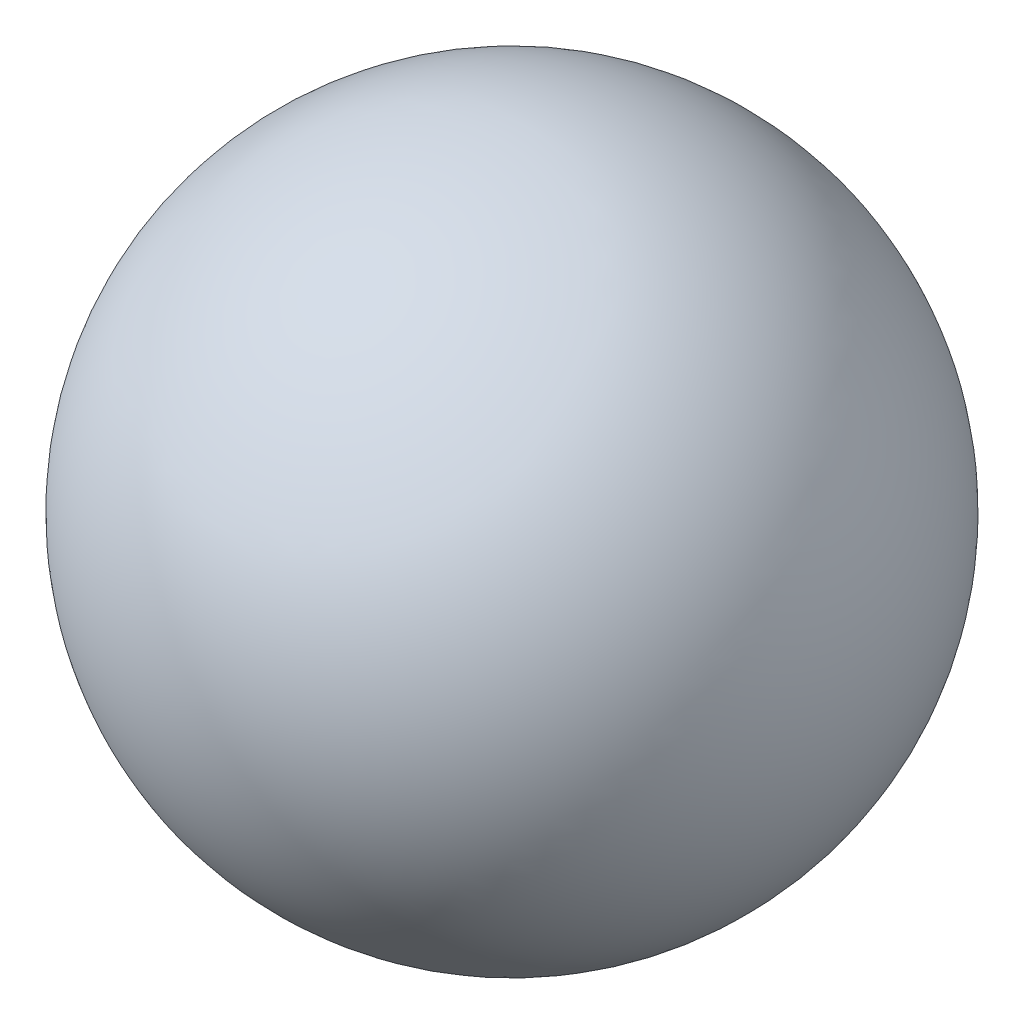
ISO-10303-21;
HEADER;
FILE_DESCRIPTION(('STEP AP214'),'2;1');
FILE_NAME('part.step','',(''),(''),'','','');
FILE_SCHEMA(('AUTOMOTIVE_DESIGN { 1 0 10303 214 1 1 1 1 }'));
ENDSEC;
DATA;
#1=APPLICATION_CONTEXT('core data for automotive mechanical design processes');
#2=APPLICATION_PROTOCOL_DEFINITION('international standard','automotive_design',2000,#1);
#3=PRODUCT_CONTEXT('',#1,'mechanical');
#4=PRODUCT('Part','Part','',(#3));
#5=PRODUCT_RELATED_PRODUCT_CATEGORY('part','',(#4));
#6=PRODUCT_DEFINITION_FORMATION('','',#4);
#7=PRODUCT_DEFINITION_CONTEXT('part definition',#1,'design');
#8=PRODUCT_DEFINITION('design','',#6,#7);
#9=PRODUCT_DEFINITION_SHAPE('','',#8);
#10=(LENGTH_UNIT() NAMED_UNIT(*) SI_UNIT(.MILLI.,.METRE.));
#11=(NAMED_UNIT(*) PLANE_ANGLE_UNIT() SI_UNIT($,.RADIAN.));
#12=(NAMED_UNIT(*) SI_UNIT($,.STERADIAN.) SOLID_ANGLE_UNIT());
#13=UNCERTAINTY_MEASURE_WITH_UNIT(LENGTH_MEASURE(1.E-05),#10,'distance_accuracy_value','');
#14=(GEOMETRIC_REPRESENTATION_CONTEXT(3) GLOBAL_UNCERTAINTY_ASSIGNED_CONTEXT((#13)) GLOBAL_UNIT_ASSIGNED_CONTEXT((#10,
#11,#12)) REPRESENTATION_CONTEXT('',''));
#15=CARTESIAN_POINT('',(0.,0.,0.));
#16=DIRECTION('',(0.,0.,1.));
#17=DIRECTION('',(1.,0.,0.));
#18=AXIS2_PLACEMENT_3D('',#15,#16,#17);
#19=CARTESIAN_POINT('',(0.,0.,0.));
#20=DIRECTION('',(0.,0.,1.));
#21=DIRECTION('',(0.,1.,0.));
#22=AXIS2_PLACEMENT_3D('',#19,#20,#21);
#23=SPHERICAL_SURFACE('',#22,12.);
#24=CARTESIAN_POINT('',(0.,0.,12.));
#25=VERTEX_POINT('',#24);
#26=VERTEX_LOOP('',#25);
#27=FACE_BOUND('',#26,.T.);
#28=ADVANCED_FACE('F37',(#27),#23,.T.);
#29=CLOSED_SHELL('',(#28));
#30=MANIFOLD_SOLID_BREP('B2',#29);
#31=ADVANCED_BREP_SHAPE_REPRESENTATION('',(#18,#30),#14);
#32=SHAPE_DEFINITION_REPRESENTATION(#9,#31);
ENDSEC;
END-ISO-10303-21;
